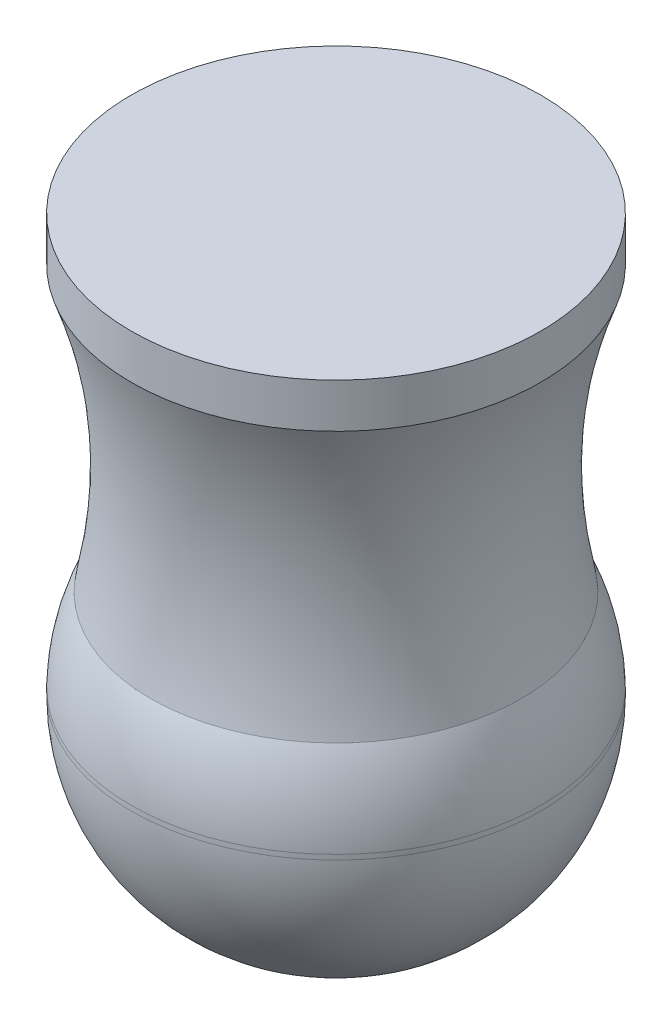
ISO-10303-21;
HEADER;
FILE_DESCRIPTION(('STEP AP214'),'2;1');
FILE_NAME('part.step','',(''),(''),'','','');
FILE_SCHEMA(('AUTOMOTIVE_DESIGN { 1 0 10303 214 1 1 1 1 }'));
ENDSEC;
DATA;
#1=APPLICATION_CONTEXT('core data for automotive mechanical design processes');
#2=APPLICATION_PROTOCOL_DEFINITION('international standard','automotive_design',2000,#1);
#3=PRODUCT_CONTEXT('',#1,'mechanical');
#4=PRODUCT('Part','Part','',(#3));
#5=PRODUCT_RELATED_PRODUCT_CATEGORY('part','',(#4));
#6=PRODUCT_DEFINITION_FORMATION('','',#4);
#7=PRODUCT_DEFINITION_CONTEXT('part definition',#1,'design');
#8=PRODUCT_DEFINITION('design','',#6,#7);
#9=PRODUCT_DEFINITION_SHAPE('','',#8);
#10=(LENGTH_UNIT() NAMED_UNIT(*) SI_UNIT(.MILLI.,.METRE.));
#11=(NAMED_UNIT(*) PLANE_ANGLE_UNIT() SI_UNIT($,.RADIAN.));
#12=(NAMED_UNIT(*) SI_UNIT($,.STERADIAN.) SOLID_ANGLE_UNIT());
#13=UNCERTAINTY_MEASURE_WITH_UNIT(LENGTH_MEASURE(1.E-05),#10,'distance_accuracy_value','');
#14=(GEOMETRIC_REPRESENTATION_CONTEXT(3) GLOBAL_UNCERTAINTY_ASSIGNED_CONTEXT((#13)) GLOBAL_UNIT_ASSIGNED_CONTEXT((#10,
#11,#12)) REPRESENTATION_CONTEXT('',''));
#15=CARTESIAN_POINT('',(0.,0.,0.));
#16=DIRECTION('',(0.,0.,1.));
#17=DIRECTION('',(1.,0.,0.));
#18=AXIS2_PLACEMENT_3D('',#15,#16,#17);
#19=CARTESIAN_POINT('',(0.,7.6,0.));
#20=DIRECTION('',(0.,-1.,0.));
#21=DIRECTION('',(0.,0.,-1.));
#22=AXIS2_PLACEMENT_3D('',#19,#20,#21);
#23=CYLINDRICAL_SURFACE('',#22,3.00368810132428);
#24=CARTESIAN_POINT('',(0.,1.5,0.));
#25=DIRECTION('',(0.,1.,0.));
#26=DIRECTION('',(0.,0.,1.));
#27=AXIS2_PLACEMENT_3D('',#24,#25,#26);
#28=CIRCLE('',#27,3.00368810132428);
#29=CARTESIAN_POINT('',(0.,1.5,3.00368810132428));
#30=VERTEX_POINT('',#29);
#31=EDGE_CURVE('E10',#30,#30,#28,.T.);
#32=ORIENTED_EDGE('',*,*,#31,.T.);
#33=EDGE_LOOP('',(#32));
#34=FACE_BOUND('',#33,.T.);
#35=CARTESIAN_POINT('',(0.,1.57242376773112,0.));
#36=DIRECTION('',(0.,-1.,0.));
#37=DIRECTION('',(0.,0.,-1.));
#38=AXIS2_PLACEMENT_3D('',#35,#36,#37);
#39=CIRCLE('',#38,3.00368810132428);
#40=CARTESIAN_POINT('',(0.,1.57242376773112,-3.00368810132428));
#41=VERTEX_POINT('',#40);
#42=EDGE_CURVE('E39',#41,#41,#39,.F.);
#43=ORIENTED_EDGE('',*,*,#42,.F.);
#44=EDGE_LOOP('',(#43));
#45=FACE_BOUND('',#44,.T.);
#46=ADVANCED_FACE('F35',(#34,#45),#23,.T.);
#47=CARTESIAN_POINT('',(0.,1.5,0.));
#48=DIRECTION('',(0.,1.,0.));
#49=DIRECTION('',(0.,0.,1.));
#50=AXIS2_PLACEMENT_3D('',#47,#48,#49);
#51=DEGENERATE_TOROIDAL_SURFACE('',#50,0.103688101324278,2.9,.T.);
#52=CARTESIAN_POINT('',(0.,-1.4,0.));
#53=DIRECTION('',(0.,1.,0.));
#54=DIRECTION('',(0.,0.,1.));
#55=AXIS2_PLACEMENT_3D('',#52,#53,#54);
#56=CIRCLE('',#55,0.103688101324278);
#57=CARTESIAN_POINT('',(0.,-1.4,0.103688101324278));
#58=VERTEX_POINT('',#57);
#59=EDGE_CURVE('E43',#58,#58,#56,.F.);
#60=ORIENTED_EDGE('',*,*,#59,.F.);
#61=EDGE_LOOP('',(#60));
#62=FACE_BOUND('',#61,.T.);
#63=ORIENTED_EDGE('',*,*,#31,.F.);
#64=EDGE_LOOP('',(#63));
#65=FACE_BOUND('',#64,.T.);
#66=ADVANCED_FACE('F37',(#62,#65),#51,.T.);
#67=CARTESIAN_POINT('',(0.,-1.4,0.));
#68=DIRECTION('',(0.,1.,0.));
#69=DIRECTION('',(0.,0.,1.));
#70=AXIS2_PLACEMENT_3D('',#67,#68,#69);
#71=PLANE('',#70);
#72=ORIENTED_EDGE('',*,*,#59,.T.);
#73=EDGE_LOOP('',(#72));
#74=FACE_BOUND('',#73,.T.);
#75=ADVANCED_FACE('F83',(#74),#71,.F.);
#76=CARTESIAN_POINT('',(0.,1.50867011360581,0.));
#77=DIRECTION('',(0.,1.,0.));
#78=DIRECTION('',(0.,0.,1.));
#79=AXIS2_PLACEMENT_3D('',#76,#77,#78);
#80=DEGENERATE_TOROIDAL_SURFACE('',#79,0.00436559922723347,3.,.T.);
#81=CARTESIAN_POINT('',(0.,2.78630684647193,0.));
#82=DIRECTION('',(0.,1.,0.));
#83=DIRECTION('',(0.,0.,1.));
#84=AXIS2_PLACEMENT_3D('',#81,#82,#83);
#85=CIRCLE('',#84,2.71870610454914);
#86=CARTESIAN_POINT('',(0.,2.78630684647193,2.71870610454914));
#87=VERTEX_POINT('',#86);
#88=EDGE_CURVE('E53',#87,#87,#85,.T.);
#89=ORIENTED_EDGE('',*,*,#88,.F.);
#90=EDGE_LOOP('',(#89));
#91=FACE_BOUND('',#90,.T.);
#92=ORIENTED_EDGE('',*,*,#42,.T.);
#93=EDGE_LOOP('',(#92));
#94=FACE_BOUND('',#93,.T.);
#95=ADVANCED_FACE('F88',(#91,#94),#80,.T.);
#96=CARTESIAN_POINT('',(0.,6.95115374401515,-3.00436559922723));
#97=CARTESIAN_POINT('',(0.,4.94324098254511,-2.26876465558144));
#98=CARTESIAN_POINT('',(0.,2.78630684647193,-2.71870610454914));
#99=B_SPLINE_CURVE_WITH_KNOTS('',2,(#96,#97,#98),.UNSPECIFIED.,.F.,.F.,(3,3),(0.,1.),.UNSPECIFIED.);
#100=CARTESIAN_POINT('',(0.,7.6,0.));
#101=DIRECTION('',(0.,1.,0.));
#102=AXIS1_PLACEMENT('',#100,#101);
#103=SURFACE_OF_REVOLUTION('',#99,#102);
#104=ORIENTED_EDGE('',*,*,#88,.T.);
#105=EDGE_LOOP('',(#104));
#106=FACE_BOUND('',#105,.T.);
#107=CARTESIAN_POINT('',(0.,6.94930371221162,0.));
#108=DIRECTION('',(0.,1.,0.));
#109=DIRECTION('',(0.,0.,1.));
#110=AXIS2_PLACEMENT_3D('',#107,#108,#109);
#111=CIRCLE('',#110,3.00368810132428);
#112=CARTESIAN_POINT('',(0.,6.94930371221162,3.00368810132428));
#113=VERTEX_POINT('',#112);
#114=EDGE_CURVE('E51',#113,#113,#111,.F.);
#115=ORIENTED_EDGE('',*,*,#114,.T.);
#116=EDGE_LOOP('',(#115));
#117=FACE_BOUND('',#116,.T.);
#118=ADVANCED_FACE('F76',(#106,#117),#103,.F.);
#119=CARTESIAN_POINT('',(0.,7.6,0.));
#120=DIRECTION('',(0.,1.,0.));
#121=DIRECTION('',(0.,0.,1.));
#122=AXIS2_PLACEMENT_3D('',#119,#120,#121);
#123=PLANE('',#122);
#124=CARTESIAN_POINT('',(0.,7.6,0.));
#125=DIRECTION('',(0.,1.,0.));
#126=DIRECTION('',(0.,0.,1.));
#127=AXIS2_PLACEMENT_3D('',#124,#125,#126);
#128=CIRCLE('',#127,3.00368810132428);
#129=CARTESIAN_POINT('',(0.,7.6,3.00368810132428));
#130=VERTEX_POINT('',#129);
#131=EDGE_CURVE('E48',#130,#130,#128,.T.);
#132=ORIENTED_EDGE('',*,*,#131,.T.);
#133=EDGE_LOOP('',(#132));
#134=FACE_BOUND('',#133,.T.);
#135=ADVANCED_FACE('F68',(#134),#123,.T.);
#136=ORIENTED_EDGE('',*,*,#131,.F.);
#137=EDGE_LOOP('',(#136));
#138=FACE_BOUND('',#137,.T.);
#139=ORIENTED_EDGE('',*,*,#114,.F.);
#140=EDGE_LOOP('',(#139));
#141=FACE_BOUND('',#140,.T.);
#142=ADVANCED_FACE('F70',(#138,#141),#23,.T.);
#143=CLOSED_SHELL('',(#46,#66,#75,#95,#118,#135,#142));
#144=MANIFOLD_SOLID_BREP('B2',#143);
#145=ADVANCED_BREP_SHAPE_REPRESENTATION('',(#18,#144),#14);
#146=SHAPE_DEFINITION_REPRESENTATION(#9,#145);
ENDSEC;
END-ISO-10303-21;
